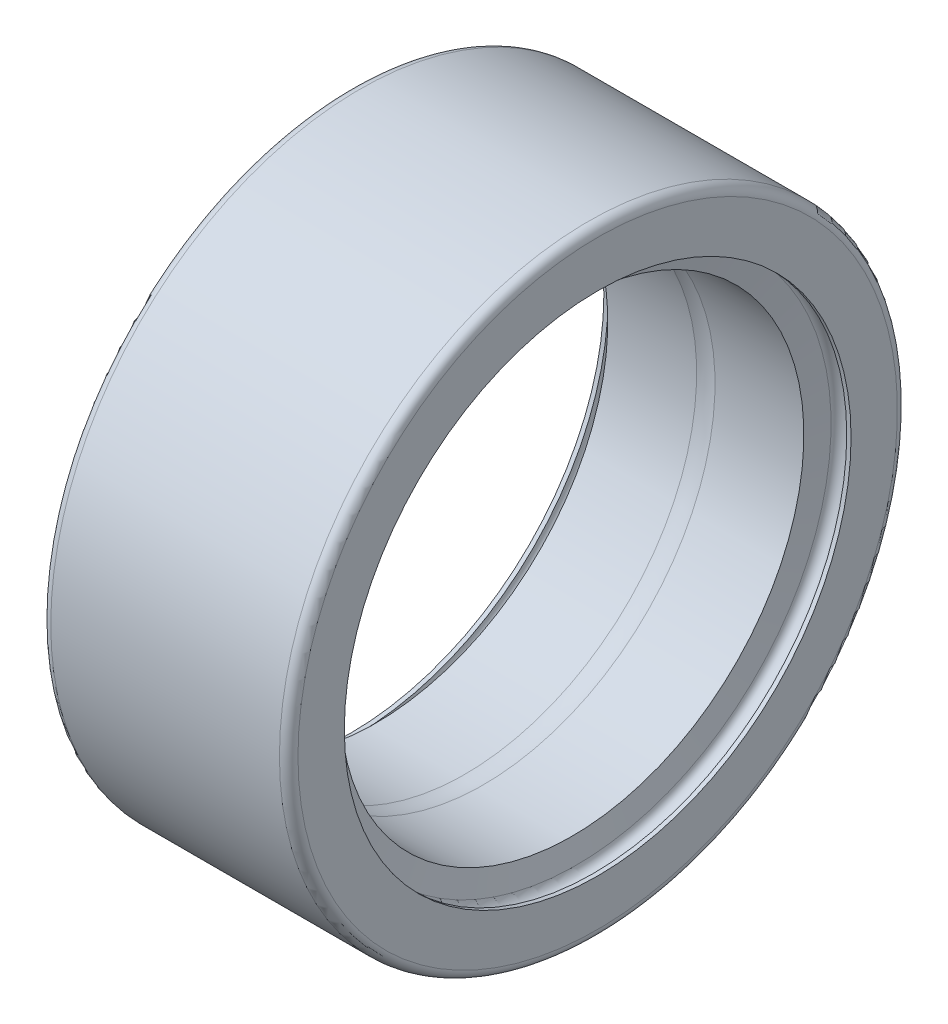
ISO-10303-21;
HEADER;
FILE_DESCRIPTION(('STEP AP214'),'2;1');
FILE_NAME('part.step','',(''),(''),'','','');
FILE_SCHEMA(('AUTOMOTIVE_DESIGN { 1 0 10303 214 1 1 1 1 }'));
ENDSEC;
DATA;
#1=APPLICATION_CONTEXT('core data for automotive mechanical design processes');
#2=APPLICATION_PROTOCOL_DEFINITION('international standard','automotive_design',2000,#1);
#3=PRODUCT_CONTEXT('',#1,'mechanical');
#4=PRODUCT('Part','Part','',(#3));
#5=PRODUCT_RELATED_PRODUCT_CATEGORY('part','',(#4));
#6=PRODUCT_DEFINITION_FORMATION('','',#4);
#7=PRODUCT_DEFINITION_CONTEXT('part definition',#1,'design');
#8=PRODUCT_DEFINITION('design','',#6,#7);
#9=PRODUCT_DEFINITION_SHAPE('','',#8);
#10=(LENGTH_UNIT() NAMED_UNIT(*) SI_UNIT(.MILLI.,.METRE.));
#11=(NAMED_UNIT(*) PLANE_ANGLE_UNIT() SI_UNIT($,.RADIAN.));
#12=(NAMED_UNIT(*) SI_UNIT($,.STERADIAN.) SOLID_ANGLE_UNIT());
#13=UNCERTAINTY_MEASURE_WITH_UNIT(LENGTH_MEASURE(1.E-05),#10,'distance_accuracy_value','');
#14=(GEOMETRIC_REPRESENTATION_CONTEXT(3) GLOBAL_UNCERTAINTY_ASSIGNED_CONTEXT((#13)) GLOBAL_UNIT_ASSIGNED_CONTEXT((#10,
#11,#12)) REPRESENTATION_CONTEXT('',''));
#15=CARTESIAN_POINT('',(0.,0.,0.));
#16=DIRECTION('',(0.,0.,1.));
#17=DIRECTION('',(1.,0.,0.));
#18=AXIS2_PLACEMENT_3D('',#15,#16,#17);
#19=CARTESIAN_POINT('',(3.58612583108804,0.,0.));
#20=DIRECTION('',(1.,0.,0.));
#21=DIRECTION('',(0.,0.,-1.));
#22=AXIS2_PLACEMENT_3D('',#19,#20,#21);
#23=CONICAL_SURFACE('',#22,3.75,1.39626340159546);
#24=CARTESIAN_POINT('',(3.65212691457829,0.,0.));
#25=DIRECTION('',(-1.,0.,0.));
#26=DIRECTION('',(0.,0.,1.));
#27=AXIS2_PLACEMENT_3D('',#24,#25,#26);
#28=CIRCLE('',#27,4.12431074487337);
#29=CARTESIAN_POINT('',(3.65212691457829,0.,4.12431074487337));
#30=VERTEX_POINT('',#29);
#31=EDGE_CURVE('E10',#30,#30,#28,.T.);
#32=ORIENTED_EDGE('',*,*,#31,.F.);
#33=EDGE_LOOP('',(#32));
#34=FACE_BOUND('',#33,.T.);
#35=CARTESIAN_POINT('',(3.58612583108804,0.,0.));
#36=DIRECTION('',(-1.,0.,0.));
#37=DIRECTION('',(0.,0.,1.));
#38=AXIS2_PLACEMENT_3D('',#35,#36,#37);
#39=CIRCLE('',#38,3.75);
#40=CARTESIAN_POINT('',(3.58612583108804,0.,3.75));
#41=VERTEX_POINT('',#40);
#42=EDGE_CURVE('E80',#41,#41,#39,.T.);
#43=ORIENTED_EDGE('',*,*,#42,.T.);
#44=EDGE_LOOP('',(#43));
#45=FACE_BOUND('',#44,.T.);
#46=ADVANCED_FACE('F14',(#34,#45),#23,.F.);
#47=CARTESIAN_POINT('',(3.79,0.,0.));
#48=DIRECTION('',(-1.,0.,0.));
#49=DIRECTION('',(0.,0.,1.));
#50=AXIS2_PLACEMENT_3D('',#47,#48,#49);
#51=TOROIDAL_SURFACE('',#50,4.1,0.14);
#52=ORIENTED_EDGE('',*,*,#31,.T.);
#53=EDGE_LOOP('',(#52));
#54=FACE_BOUND('',#53,.T.);
#55=CARTESIAN_POINT('',(3.93,0.,0.));
#56=DIRECTION('',(-1.,0.,0.));
#57=DIRECTION('',(0.,0.,1.));
#58=AXIS2_PLACEMENT_3D('',#55,#56,#57);
#59=CIRCLE('',#58,4.1);
#60=CARTESIAN_POINT('',(3.93,0.,4.1));
#61=VERTEX_POINT('',#60);
#62=EDGE_CURVE('E21',#61,#61,#59,.T.);
#63=ORIENTED_EDGE('',*,*,#62,.F.);
#64=EDGE_LOOP('',(#63));
#65=FACE_BOUND('',#64,.T.);
#66=ADVANCED_FACE('F105',(#54,#65),#51,.F.);
#67=CARTESIAN_POINT('',(0.,0.,0.));
#68=DIRECTION('',(-1.,0.,0.));
#69=DIRECTION('',(0.,0.,1.));
#70=AXIS2_PLACEMENT_3D('',#67,#68,#69);
#71=CYLINDRICAL_SURFACE('',#70,4.1);
#72=ORIENTED_EDGE('',*,*,#62,.T.);
#73=EDGE_LOOP('',(#72));
#74=FACE_BOUND('',#73,.T.);
#75=CARTESIAN_POINT('',(4.,0.,0.));
#76=DIRECTION('',(-1.,0.,0.));
#77=DIRECTION('',(0.,0.,1.));
#78=AXIS2_PLACEMENT_3D('',#75,#76,#77);
#79=CIRCLE('',#78,4.1);
#80=CARTESIAN_POINT('',(4.,0.,4.1));
#81=VERTEX_POINT('',#80);
#82=EDGE_CURVE('E30',#81,#81,#79,.T.);
#83=ORIENTED_EDGE('',*,*,#82,.F.);
#84=EDGE_LOOP('',(#83));
#85=FACE_BOUND('',#84,.T.);
#86=ADVANCED_FACE('F110',(#74,#85),#71,.F.);
#87=CARTESIAN_POINT('',(4.,4.1,0.));
#88=DIRECTION('',(-1.,0.,0.));
#89=DIRECTION('',(0.,0.,1.));
#90=AXIS2_PLACEMENT_3D('',#87,#88,#89);
#91=PLANE('',#90);
#92=CARTESIAN_POINT('',(4.,0.,0.));
#93=DIRECTION('',(-1.,0.,0.));
#94=DIRECTION('',(0.,0.,1.));
#95=AXIS2_PLACEMENT_3D('',#92,#93,#94);
#96=CIRCLE('',#95,4.85);
#97=CARTESIAN_POINT('',(4.,0.,4.85));
#98=VERTEX_POINT('',#97);
#99=EDGE_CURVE('E38',#98,#98,#96,.T.);
#100=ORIENTED_EDGE('',*,*,#99,.F.);
#101=EDGE_LOOP('',(#100));
#102=FACE_BOUND('',#101,.T.);
#103=ORIENTED_EDGE('',*,*,#82,.T.);
#104=EDGE_LOOP('',(#103));
#105=FACE_BOUND('',#104,.T.);
#106=ADVANCED_FACE('F114',(#102,#105),#91,.F.);
#107=CARTESIAN_POINT('',(3.85,0.,0.));
#108=DIRECTION('',(-1.,0.,0.));
#109=DIRECTION('',(0.,0.,1.));
#110=AXIS2_PLACEMENT_3D('',#107,#108,#109);
#111=TOROIDAL_SURFACE('',#110,4.85,0.15);
#112=CARTESIAN_POINT('',(3.85,0.,0.));
#113=DIRECTION('',(-1.,0.,0.));
#114=DIRECTION('',(0.,0.,1.));
#115=AXIS2_PLACEMENT_3D('',#112,#113,#114);
#116=CIRCLE('',#115,5.);
#117=CARTESIAN_POINT('',(3.85,0.,5.));
#118=VERTEX_POINT('',#117);
#119=EDGE_CURVE('E44',#118,#118,#116,.T.);
#120=ORIENTED_EDGE('',*,*,#119,.F.);
#121=EDGE_LOOP('',(#120));
#122=FACE_BOUND('',#121,.T.);
#123=ORIENTED_EDGE('',*,*,#99,.T.);
#124=EDGE_LOOP('',(#123));
#125=FACE_BOUND('',#124,.T.);
#126=ADVANCED_FACE('F120',(#122,#125),#111,.T.);
#127=CARTESIAN_POINT('',(0.,0.,0.));
#128=DIRECTION('',(-1.,0.,0.));
#129=DIRECTION('',(0.,0.,1.));
#130=AXIS2_PLACEMENT_3D('',#127,#128,#129);
#131=CYLINDRICAL_SURFACE('',#130,5.);
#132=ORIENTED_EDGE('',*,*,#119,.T.);
#133=EDGE_LOOP('',(#132));
#134=FACE_BOUND('',#133,.T.);
#135=CARTESIAN_POINT('',(0.15,0.,0.));
#136=DIRECTION('',(-1.,0.,0.));
#137=DIRECTION('',(0.,0.,1.));
#138=AXIS2_PLACEMENT_3D('',#135,#136,#137);
#139=CIRCLE('',#138,5.);
#140=CARTESIAN_POINT('',(0.15,0.,5.));
#141=VERTEX_POINT('',#140);
#142=EDGE_CURVE('E48',#141,#141,#139,.T.);
#143=ORIENTED_EDGE('',*,*,#142,.F.);
#144=EDGE_LOOP('',(#143));
#145=FACE_BOUND('',#144,.T.);
#146=ADVANCED_FACE('F124',(#134,#145),#131,.T.);
#147=CARTESIAN_POINT('',(0.15,0.,0.));
#148=DIRECTION('',(-1.,0.,0.));
#149=DIRECTION('',(0.,0.,1.));
#150=AXIS2_PLACEMENT_3D('',#147,#148,#149);
#151=TOROIDAL_SURFACE('',#150,4.85,0.15);
#152=CARTESIAN_POINT('',(0.,0.,0.));
#153=DIRECTION('',(-1.,0.,0.));
#154=DIRECTION('',(0.,0.,1.));
#155=AXIS2_PLACEMENT_3D('',#152,#153,#154);
#156=CIRCLE('',#155,4.85);
#157=CARTESIAN_POINT('',(0.,0.,4.85));
#158=VERTEX_POINT('',#157);
#159=EDGE_CURVE('E52',#158,#158,#156,.T.);
#160=ORIENTED_EDGE('',*,*,#159,.F.);
#161=EDGE_LOOP('',(#160));
#162=FACE_BOUND('',#161,.T.);
#163=ORIENTED_EDGE('',*,*,#142,.T.);
#164=EDGE_LOOP('',(#163));
#165=FACE_BOUND('',#164,.T.);
#166=ADVANCED_FACE('F128',(#162,#165),#151,.T.);
#167=CARTESIAN_POINT('',(0.,4.1,0.));
#168=DIRECTION('',(-1.,0.,0.));
#169=DIRECTION('',(0.,0.,1.));
#170=AXIS2_PLACEMENT_3D('',#167,#168,#169);
#171=PLANE('',#170);
#172=ORIENTED_EDGE('',*,*,#159,.T.);
#173=EDGE_LOOP('',(#172));
#174=FACE_BOUND('',#173,.T.);
#175=CARTESIAN_POINT('',(0.,0.,0.));
#176=DIRECTION('',(-1.,0.,0.));
#177=DIRECTION('',(0.,0.,1.));
#178=AXIS2_PLACEMENT_3D('',#175,#176,#177);
#179=CIRCLE('',#178,4.1);
#180=CARTESIAN_POINT('',(0.,0.,4.1));
#181=VERTEX_POINT('',#180);
#182=EDGE_CURVE('E56',#181,#181,#179,.T.);
#183=ORIENTED_EDGE('',*,*,#182,.F.);
#184=EDGE_LOOP('',(#183));
#185=FACE_BOUND('',#184,.T.);
#186=ADVANCED_FACE('F132',(#174,#185),#171,.T.);
#187=CARTESIAN_POINT('',(0.,0.,0.));
#188=DIRECTION('',(-1.,0.,0.));
#189=DIRECTION('',(0.,0.,1.));
#190=AXIS2_PLACEMENT_3D('',#187,#188,#189);
#191=CYLINDRICAL_SURFACE('',#190,4.1);
#192=CARTESIAN_POINT('',(0.07,0.,0.));
#193=DIRECTION('',(-1.,0.,0.));
#194=DIRECTION('',(0.,0.,1.));
#195=AXIS2_PLACEMENT_3D('',#192,#193,#194);
#196=CIRCLE('',#195,4.1);
#197=CARTESIAN_POINT('',(0.07,0.,4.1));
#198=VERTEX_POINT('',#197);
#199=EDGE_CURVE('E60',#198,#198,#196,.T.);
#200=ORIENTED_EDGE('',*,*,#199,.F.);
#201=EDGE_LOOP('',(#200));
#202=FACE_BOUND('',#201,.T.);
#203=ORIENTED_EDGE('',*,*,#182,.T.);
#204=EDGE_LOOP('',(#203));
#205=FACE_BOUND('',#204,.T.);
#206=ADVANCED_FACE('F136',(#202,#205),#191,.F.);
#207=CARTESIAN_POINT('',(0.21,0.,0.));
#208=DIRECTION('',(-1.,0.,0.));
#209=DIRECTION('',(0.,0.,1.));
#210=AXIS2_PLACEMENT_3D('',#207,#208,#209);
#211=TOROIDAL_SURFACE('',#210,4.1,0.14);
#212=ORIENTED_EDGE('',*,*,#199,.T.);
#213=EDGE_LOOP('',(#212));
#214=FACE_BOUND('',#213,.T.);
#215=CARTESIAN_POINT('',(0.347873085421709,0.,0.));
#216=DIRECTION('',(-1.,0.,0.));
#217=DIRECTION('',(0.,0.,1.));
#218=AXIS2_PLACEMENT_3D('',#215,#216,#217);
#219=CIRCLE('',#218,4.12431074487337);
#220=CARTESIAN_POINT('',(0.347873085421709,0.,4.12431074487337));
#221=VERTEX_POINT('',#220);
#222=EDGE_CURVE('E64',#221,#221,#219,.T.);
#223=ORIENTED_EDGE('',*,*,#222,.F.);
#224=EDGE_LOOP('',(#223));
#225=FACE_BOUND('',#224,.T.);
#226=ADVANCED_FACE('F140',(#214,#225),#211,.F.);
#227=CARTESIAN_POINT('',(0.413874168911966,0.,0.));
#228=DIRECTION('',(-1.,0.,0.));
#229=DIRECTION('',(0.,0.,1.));
#230=AXIS2_PLACEMENT_3D('',#227,#228,#229);
#231=CONICAL_SURFACE('',#230,3.75,1.39626340159546);
#232=ORIENTED_EDGE('',*,*,#222,.T.);
#233=EDGE_LOOP('',(#232));
#234=FACE_BOUND('',#233,.T.);
#235=CARTESIAN_POINT('',(0.413874168911966,0.,0.));
#236=DIRECTION('',(-1.,0.,0.));
#237=DIRECTION('',(0.,0.,1.));
#238=AXIS2_PLACEMENT_3D('',#235,#236,#237);
#239=CIRCLE('',#238,3.75);
#240=CARTESIAN_POINT('',(0.413874168911966,0.,3.75));
#241=VERTEX_POINT('',#240);
#242=EDGE_CURVE('E68',#241,#241,#239,.T.);
#243=ORIENTED_EDGE('',*,*,#242,.F.);
#244=EDGE_LOOP('',(#243));
#245=FACE_BOUND('',#244,.T.);
#246=ADVANCED_FACE('F101',(#234,#245),#231,.F.);
#247=CARTESIAN_POINT('',(0.,0.,0.));
#248=DIRECTION('',(-1.,0.,0.));
#249=DIRECTION('',(0.,0.,1.));
#250=AXIS2_PLACEMENT_3D('',#247,#248,#249);
#251=CYLINDRICAL_SURFACE('',#250,3.75);
#252=CARTESIAN_POINT('',(1.85155472388789,0.,0.));
#253=DIRECTION('',(-1.,0.,0.));
#254=DIRECTION('',(0.,0.,1.));
#255=AXIS2_PLACEMENT_3D('',#252,#253,#254);
#256=CIRCLE('',#255,3.75);
#257=CARTESIAN_POINT('',(1.85155472388789,0.,3.75));
#258=VERTEX_POINT('',#257);
#259=EDGE_CURVE('E72',#258,#258,#256,.T.);
#260=ORIENTED_EDGE('',*,*,#259,.F.);
#261=EDGE_LOOP('',(#260));
#262=FACE_BOUND('',#261,.T.);
#263=ORIENTED_EDGE('',*,*,#242,.T.);
#264=EDGE_LOOP('',(#263));
#265=FACE_BOUND('',#264,.T.);
#266=ADVANCED_FACE('F94',(#262,#265),#251,.F.);
#267=CARTESIAN_POINT('',(2.,0.,0.));
#268=DIRECTION('',(-1.,0.,0.));
#269=DIRECTION('',(0.,0.,1.));
#270=AXIS2_PLACEMENT_3D('',#267,#268,#269);
#271=TOROIDAL_SURFACE('',#270,2.97,0.794);
#272=ORIENTED_EDGE('',*,*,#259,.T.);
#273=EDGE_LOOP('',(#272));
#274=FACE_BOUND('',#273,.T.);
#275=CARTESIAN_POINT('',(2.14844527611211,0.,0.));
#276=DIRECTION('',(-1.,0.,0.));
#277=DIRECTION('',(0.,0.,1.));
#278=AXIS2_PLACEMENT_3D('',#275,#276,#277);
#279=CIRCLE('',#278,3.75);
#280=CARTESIAN_POINT('',(2.14844527611211,0.,3.75));
#281=VERTEX_POINT('',#280);
#282=EDGE_CURVE('E76',#281,#281,#279,.T.);
#283=ORIENTED_EDGE('',*,*,#282,.F.);
#284=EDGE_LOOP('',(#283));
#285=FACE_BOUND('',#284,.T.);
#286=ADVANCED_FACE('F89',(#274,#285),#271,.F.);
#287=CARTESIAN_POINT('',(0.,0.,0.));
#288=DIRECTION('',(-1.,0.,0.));
#289=DIRECTION('',(0.,0.,1.));
#290=AXIS2_PLACEMENT_3D('',#287,#288,#289);
#291=CYLINDRICAL_SURFACE('',#290,3.75);
#292=ORIENTED_EDGE('',*,*,#42,.F.);
#293=EDGE_LOOP('',(#292));
#294=FACE_BOUND('',#293,.T.);
#295=ORIENTED_EDGE('',*,*,#282,.T.);
#296=EDGE_LOOP('',(#295));
#297=FACE_BOUND('',#296,.T.);
#298=ADVANCED_FACE('F86',(#294,#297),#291,.F.);
#299=CLOSED_SHELL('',(#46,#66,#86,#106,#126,#146,#166,#186,#206,#226,#246,#266,#286,#298));
#300=MANIFOLD_SOLID_BREP('B1',#299);
#301=ADVANCED_BREP_SHAPE_REPRESENTATION('',(#18,#300),#14);
#302=SHAPE_DEFINITION_REPRESENTATION(#9,#301);
ENDSEC;
END-ISO-10303-21;
